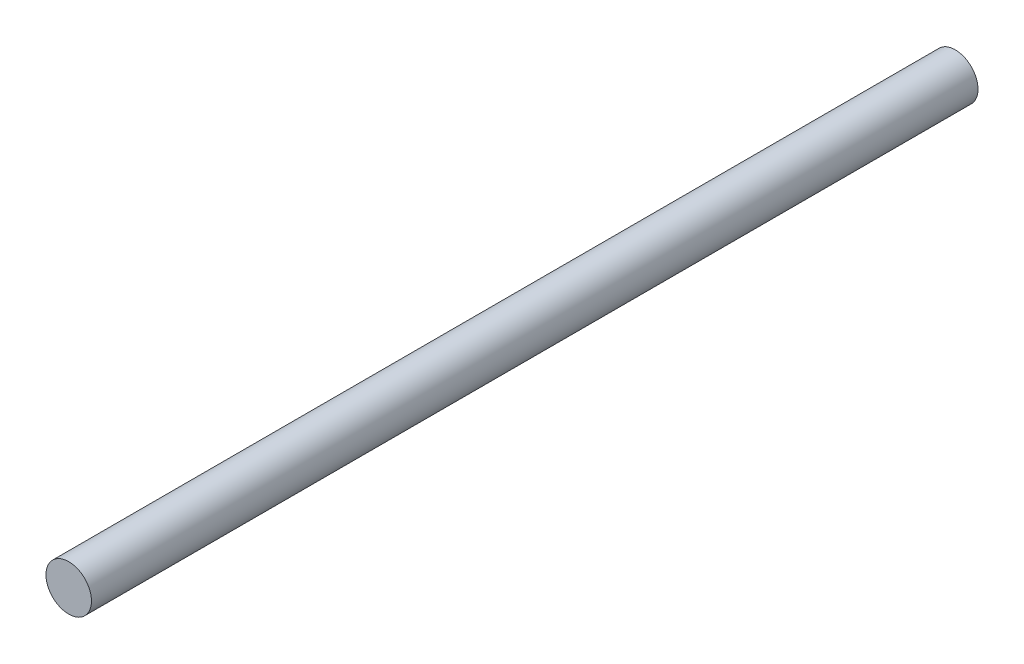
ISO-10303-21;
HEADER;
FILE_DESCRIPTION(('STEP AP214'),'2;1');
FILE_NAME('part.step','',(''),(''),'','','');
FILE_SCHEMA(('AUTOMOTIVE_DESIGN { 1 0 10303 214 1 1 1 1 }'));
ENDSEC;
DATA;
#1=APPLICATION_CONTEXT('core data for automotive mechanical design processes');
#2=APPLICATION_PROTOCOL_DEFINITION('international standard','automotive_design',2000,#1);
#3=PRODUCT_CONTEXT('',#1,'mechanical');
#4=PRODUCT('Part','Part','',(#3));
#5=PRODUCT_RELATED_PRODUCT_CATEGORY('part','',(#4));
#6=PRODUCT_DEFINITION_FORMATION('','',#4);
#7=PRODUCT_DEFINITION_CONTEXT('part definition',#1,'design');
#8=PRODUCT_DEFINITION('design','',#6,#7);
#9=PRODUCT_DEFINITION_SHAPE('','',#8);
#10=(LENGTH_UNIT() NAMED_UNIT(*) SI_UNIT(.MILLI.,.METRE.));
#11=(NAMED_UNIT(*) PLANE_ANGLE_UNIT() SI_UNIT($,.RADIAN.));
#12=(NAMED_UNIT(*) SI_UNIT($,.STERADIAN.) SOLID_ANGLE_UNIT());
#13=UNCERTAINTY_MEASURE_WITH_UNIT(LENGTH_MEASURE(1.E-05),#10,'distance_accuracy_value','');
#14=(GEOMETRIC_REPRESENTATION_CONTEXT(3) GLOBAL_UNCERTAINTY_ASSIGNED_CONTEXT((#13)) GLOBAL_UNIT_ASSIGNED_CONTEXT((#10,
#11,#12)) REPRESENTATION_CONTEXT('',''));
#15=CARTESIAN_POINT('',(0.,0.,0.));
#16=DIRECTION('',(0.,0.,1.));
#17=DIRECTION('',(1.,0.,0.));
#18=AXIS2_PLACEMENT_3D('',#15,#16,#17);
#19=CARTESIAN_POINT('',(0.,0.,52.6));
#20=DIRECTION('',(0.,0.,-1.));
#21=DIRECTION('',(-1.,0.,0.));
#22=AXIS2_PLACEMENT_3D('',#19,#20,#21);
#23=CYLINDRICAL_SURFACE('',#22,1.35);
#24=CARTESIAN_POINT('',(0.,0.,52.6));
#25=DIRECTION('',(0.,0.,1.));
#26=DIRECTION('',(1.,0.,0.));
#27=AXIS2_PLACEMENT_3D('',#24,#25,#26);
#28=CIRCLE('',#27,1.35);
#29=CARTESIAN_POINT('',(1.35,0.,52.6));
#30=VERTEX_POINT('',#29);
#31=EDGE_CURVE('E10',#30,#30,#28,.T.);
#32=ORIENTED_EDGE('',*,*,#31,.F.);
#33=EDGE_LOOP('',(#32));
#34=FACE_BOUND('',#33,.T.);
#35=CARTESIAN_POINT('',(0.,0.,0.));
#36=DIRECTION('',(0.,0.,1.));
#37=DIRECTION('',(1.,0.,0.));
#38=AXIS2_PLACEMENT_3D('',#35,#36,#37);
#39=CIRCLE('',#38,1.35);
#40=CARTESIAN_POINT('',(1.35,0.,0.));
#41=VERTEX_POINT('',#40);
#42=EDGE_CURVE('E40',#41,#41,#39,.T.);
#43=ORIENTED_EDGE('',*,*,#42,.T.);
#44=EDGE_LOOP('',(#43));
#45=FACE_BOUND('',#44,.T.);
#46=ADVANCED_FACE('F37',(#34,#45),#23,.T.);
#47=CARTESIAN_POINT('',(0.,0.,52.6));
#48=DIRECTION('',(0.,0.,1.));
#49=DIRECTION('',(1.,0.,0.));
#50=AXIS2_PLACEMENT_3D('',#47,#48,#49);
#51=PLANE('',#50);
#52=ORIENTED_EDGE('',*,*,#31,.T.);
#53=EDGE_LOOP('',(#52));
#54=FACE_BOUND('',#53,.T.);
#55=ADVANCED_FACE('F54',(#54),#51,.T.);
#56=CARTESIAN_POINT('',(0.,0.,0.));
#57=DIRECTION('',(0.,0.,1.));
#58=DIRECTION('',(1.,0.,0.));
#59=AXIS2_PLACEMENT_3D('',#56,#57,#58);
#60=PLANE('',#59);
#61=ORIENTED_EDGE('',*,*,#42,.F.);
#62=EDGE_LOOP('',(#61));
#63=FACE_BOUND('',#62,.T.);
#64=ADVANCED_FACE('F52',(#63),#60,.F.);
#65=CLOSED_SHELL('',(#46,#55,#64));
#66=MANIFOLD_SOLID_BREP('B2',#65);
#67=ADVANCED_BREP_SHAPE_REPRESENTATION('',(#18,#66),#14);
#68=SHAPE_DEFINITION_REPRESENTATION(#9,#67);
ENDSEC;
END-ISO-10303-21;
